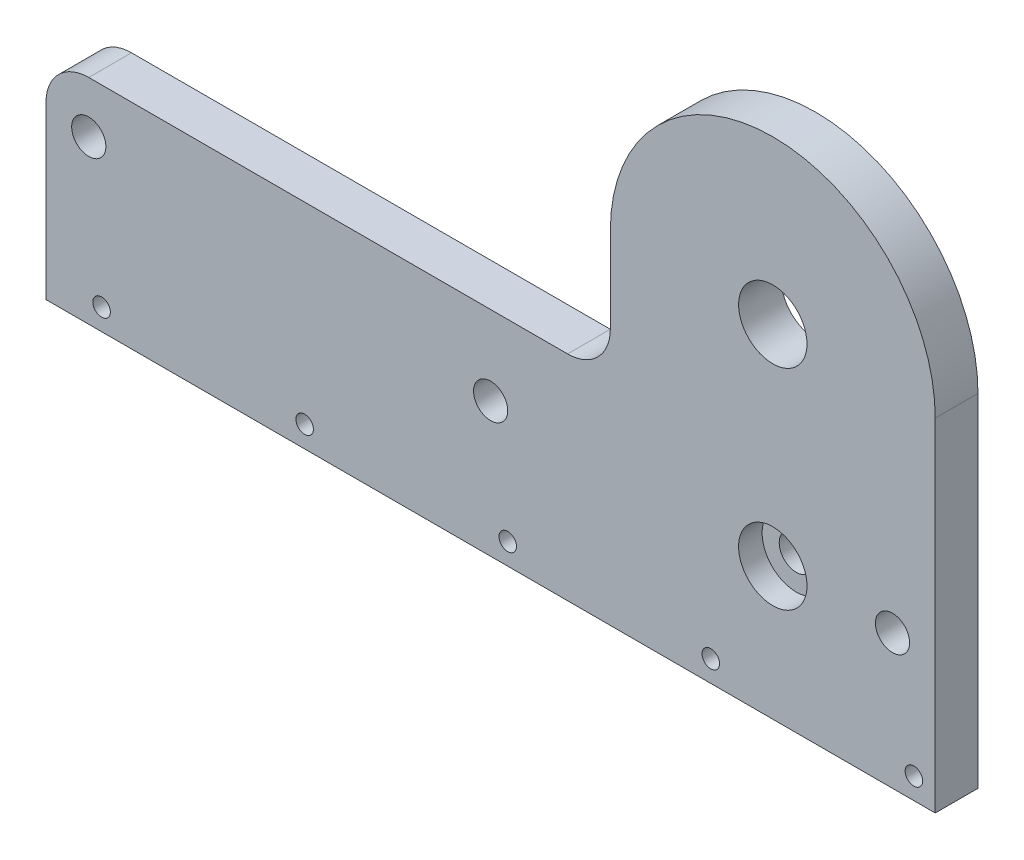
ISO-10303-21;
HEADER;
FILE_DESCRIPTION(('STEP AP214'),'2;1');
FILE_NAME('part.step','',(''),(''),'','','');
FILE_SCHEMA(('AUTOMOTIVE_DESIGN { 1 0 10303 214 1 1 1 1 }'));
ENDSEC;
DATA;
#1=APPLICATION_CONTEXT('core data for automotive mechanical design processes');
#2=APPLICATION_PROTOCOL_DEFINITION('international standard','automotive_design',2000,#1);
#3=PRODUCT_CONTEXT('',#1,'mechanical');
#4=PRODUCT('Part','Part','',(#3));
#5=PRODUCT_RELATED_PRODUCT_CATEGORY('part','',(#4));
#6=PRODUCT_DEFINITION_FORMATION('','',#4);
#7=PRODUCT_DEFINITION_CONTEXT('part definition',#1,'design');
#8=PRODUCT_DEFINITION('design','',#6,#7);
#9=PRODUCT_DEFINITION_SHAPE('','',#8);
#10=(LENGTH_UNIT() NAMED_UNIT(*) SI_UNIT(.MILLI.,.METRE.));
#11=(NAMED_UNIT(*) PLANE_ANGLE_UNIT() SI_UNIT($,.RADIAN.));
#12=(NAMED_UNIT(*) SI_UNIT($,.STERADIAN.) SOLID_ANGLE_UNIT());
#13=UNCERTAINTY_MEASURE_WITH_UNIT(LENGTH_MEASURE(1.E-05),#10,'distance_accuracy_value','');
#14=(GEOMETRIC_REPRESENTATION_CONTEXT(3) GLOBAL_UNCERTAINTY_ASSIGNED_CONTEXT((#13)) GLOBAL_UNIT_ASSIGNED_CONTEXT((#10,
#11,#12)) REPRESENTATION_CONTEXT('',''));
#15=CARTESIAN_POINT('',(0.,0.,0.));
#16=DIRECTION('',(0.,0.,1.));
#17=DIRECTION('',(1.,0.,0.));
#18=AXIS2_PLACEMENT_3D('',#15,#16,#17);
#19=CARTESIAN_POINT('',(170.,31.,-10.));
#20=DIRECTION('',(0.,0.,1.));
#21=DIRECTION('',(1.,0.,0.));
#22=AXIS2_PLACEMENT_3D('',#19,#20,#21);
#23=CYLINDRICAL_SURFACE('',#22,8.00000000000001);
#24=CARTESIAN_POINT('',(170.,31.,0.));
#25=DIRECTION('',(0.,0.,1.));
#26=DIRECTION('',(1.,0.,0.));
#27=AXIS2_PLACEMENT_3D('',#24,#25,#26);
#28=CIRCLE('',#27,8.00000000000001);
#29=CARTESIAN_POINT('',(178.,31.,0.));
#30=VERTEX_POINT('',#29);
#31=EDGE_CURVE('E156',#30,#30,#28,.T.);
#32=ORIENTED_EDGE('',*,*,#31,.T.);
#33=EDGE_LOOP('',(#32));
#34=FACE_BOUND('',#33,.T.);
#35=CARTESIAN_POINT('',(170.,31.,-5.5));
#36=DIRECTION('',(0.,0.,-1.));
#37=DIRECTION('',(-1.,0.,0.));
#38=AXIS2_PLACEMENT_3D('',#35,#36,#37);
#39=CIRCLE('',#38,8.00000000000001);
#40=CARTESIAN_POINT('',(162.,31.,-5.5));
#41=VERTEX_POINT('',#40);
#42=EDGE_CURVE('E11',#41,#41,#39,.F.);
#43=ORIENTED_EDGE('',*,*,#42,.F.);
#44=EDGE_LOOP('',(#43));
#45=FACE_BOUND('',#44,.T.);
#46=ADVANCED_FACE('F45',(#34,#45),#23,.F.);
#47=CARTESIAN_POINT('',(0.,0.,-10.));
#48=DIRECTION('',(-1.,0.,0.));
#49=DIRECTION('',(0.,0.,1.));
#50=AXIS2_PLACEMENT_3D('',#47,#48,#49);
#51=PLANE('',#50);
#52=DIRECTION('',(0.,-1.,0.));
#53=VECTOR('',#52,1.);
#54=CARTESIAN_POINT('',(0.,0.,0.));
#55=LINE('',#54,#53);
#56=CARTESIAN_POINT('',(0.,40.,0.));
#57=VERTEX_POINT('',#56);
#58=CARTESIAN_POINT('',(0.,0.,0.));
#59=VERTEX_POINT('',#58);
#60=EDGE_CURVE('E151',#57,#59,#55,.T.);
#61=ORIENTED_EDGE('',*,*,#60,.F.);
#62=DIRECTION('',(0.,0.,1.));
#63=VECTOR('',#62,1.);
#64=CARTESIAN_POINT('',(0.,40.,-10.));
#65=LINE('',#64,#63);
#66=CARTESIAN_POINT('',(0.,40.,-10.));
#67=VERTEX_POINT('',#66);
#68=EDGE_CURVE('E55',#67,#57,#65,.T.);
#69=ORIENTED_EDGE('',*,*,#68,.F.);
#70=DIRECTION('',(0.,-1.,0.));
#71=VECTOR('',#70,1.);
#72=CARTESIAN_POINT('',(0.,0.,-10.));
#73=LINE('',#72,#71);
#74=CARTESIAN_POINT('',(0.,0.,-10.));
#75=VERTEX_POINT('',#74);
#76=EDGE_CURVE('E181',#67,#75,#73,.T.);
#77=ORIENTED_EDGE('',*,*,#76,.T.);
#78=DIRECTION('',(0.,0.,1.));
#79=VECTOR('',#78,1.);
#80=CARTESIAN_POINT('',(0.,0.,-10.));
#81=LINE('',#80,#79);
#82=EDGE_CURVE('E103',#75,#59,#81,.T.);
#83=ORIENTED_EDGE('',*,*,#82,.T.);
#84=EDGE_LOOP('',(#61,#69,#77,#83));
#85=FACE_BOUND('',#84,.T.);
#86=ADVANCED_FACE('F47',(#85),#51,.T.);
#87=CARTESIAN_POINT('',(10.,40.,-10.));
#88=DIRECTION('',(0.,0.,1.));
#89=DIRECTION('',(1.,0.,0.));
#90=AXIS2_PLACEMENT_3D('',#87,#88,#89);
#91=CYLINDRICAL_SURFACE('',#90,10.);
#92=CARTESIAN_POINT('',(10.,40.,0.));
#93=DIRECTION('',(0.,0.,1.));
#94=DIRECTION('',(-1.,0.,0.));
#95=AXIS2_PLACEMENT_3D('',#92,#93,#94);
#96=CIRCLE('',#95,10.);
#97=CARTESIAN_POINT('',(10.,50.,0.));
#98=VERTEX_POINT('',#97);
#99=EDGE_CURVE('E177',#98,#57,#96,.T.);
#100=ORIENTED_EDGE('',*,*,#99,.F.);
#101=DIRECTION('',(0.,0.,1.));
#102=VECTOR('',#101,1.);
#103=CARTESIAN_POINT('',(10.,50.,-10.));
#104=LINE('',#103,#102);
#105=CARTESIAN_POINT('',(10.,50.,-10.));
#106=VERTEX_POINT('',#105);
#107=EDGE_CURVE('E91',#106,#98,#104,.T.);
#108=ORIENTED_EDGE('',*,*,#107,.F.);
#109=CARTESIAN_POINT('',(10.,40.,-10.));
#110=DIRECTION('',(0.,0.,1.));
#111=DIRECTION('',(-1.,0.,0.));
#112=AXIS2_PLACEMENT_3D('',#109,#110,#111);
#113=CIRCLE('',#112,10.);
#114=EDGE_CURVE('E137',#106,#67,#113,.T.);
#115=ORIENTED_EDGE('',*,*,#114,.T.);
#116=ORIENTED_EDGE('',*,*,#68,.T.);
#117=EDGE_LOOP('',(#100,#108,#115,#116));
#118=FACE_BOUND('',#117,.T.);
#119=ADVANCED_FACE('F201',(#118),#91,.T.);
#120=CARTESIAN_POINT('',(10.,50.,-10.));
#121=DIRECTION('',(0.,1.,0.));
#122=DIRECTION('',(0.,0.,1.));
#123=AXIS2_PLACEMENT_3D('',#120,#121,#122);
#124=PLANE('',#123);
#125=DIRECTION('',(-1.,0.,0.));
#126=VECTOR('',#125,1.);
#127=CARTESIAN_POINT('',(10.,50.,0.));
#128=LINE('',#127,#126);
#129=CARTESIAN_POINT('',(122.,50.,0.));
#130=VERTEX_POINT('',#129);
#131=EDGE_CURVE('E122',#130,#98,#128,.T.);
#132=ORIENTED_EDGE('',*,*,#131,.F.);
#133=DIRECTION('',(0.,0.,1.));
#134=VECTOR('',#133,1.);
#135=CARTESIAN_POINT('',(122.,50.,-10.));
#136=LINE('',#135,#134);
#137=CARTESIAN_POINT('',(122.,50.,-10.));
#138=VERTEX_POINT('',#137);
#139=EDGE_CURVE('E117',#138,#130,#136,.T.);
#140=ORIENTED_EDGE('',*,*,#139,.F.);
#141=DIRECTION('',(-1.,0.,0.));
#142=VECTOR('',#141,1.);
#143=CARTESIAN_POINT('',(10.,50.,-10.));
#144=LINE('',#143,#142);
#145=EDGE_CURVE('E120',#138,#106,#144,.T.);
#146=ORIENTED_EDGE('',*,*,#145,.T.);
#147=ORIENTED_EDGE('',*,*,#107,.T.);
#148=EDGE_LOOP('',(#132,#140,#146,#147));
#149=FACE_BOUND('',#148,.T.);
#150=ADVANCED_FACE('F119',(#149),#124,.T.);
#151=CARTESIAN_POINT('',(122.,60.,-10.));
#152=DIRECTION('',(0.,0.,1.));
#153=DIRECTION('',(1.,0.,0.));
#154=AXIS2_PLACEMENT_3D('',#151,#152,#153);
#155=CYLINDRICAL_SURFACE('',#154,10.);
#156=CARTESIAN_POINT('',(122.,60.,0.));
#157=DIRECTION('',(0.,0.,-1.));
#158=DIRECTION('',(1.,0.,0.));
#159=AXIS2_PLACEMENT_3D('',#156,#157,#158);
#160=CIRCLE('',#159,10.);
#161=CARTESIAN_POINT('',(132.,60.,0.));
#162=VERTEX_POINT('',#161);
#163=EDGE_CURVE('E172',#162,#130,#160,.T.);
#164=ORIENTED_EDGE('',*,*,#163,.F.);
#165=DIRECTION('',(0.,0.,1.));
#166=VECTOR('',#165,1.);
#167=CARTESIAN_POINT('',(132.,60.,-10.));
#168=LINE('',#167,#166);
#169=CARTESIAN_POINT('',(132.,60.,-10.));
#170=VERTEX_POINT('',#169);
#171=EDGE_CURVE('E128',#170,#162,#168,.T.);
#172=ORIENTED_EDGE('',*,*,#171,.F.);
#173=CARTESIAN_POINT('',(122.,60.,-10.));
#174=DIRECTION('',(0.,0.,-1.));
#175=DIRECTION('',(1.,0.,0.));
#176=AXIS2_PLACEMENT_3D('',#173,#174,#175);
#177=CIRCLE('',#176,10.);
#178=EDGE_CURVE('E135',#170,#138,#177,.T.);
#179=ORIENTED_EDGE('',*,*,#178,.T.);
#180=ORIENTED_EDGE('',*,*,#139,.T.);
#181=EDGE_LOOP('',(#164,#172,#179,#180));
#182=FACE_BOUND('',#181,.T.);
#183=ADVANCED_FACE('F140',(#182),#155,.F.);
#184=CARTESIAN_POINT('',(132.,60.,-10.));
#185=DIRECTION('',(-1.,0.,0.));
#186=DIRECTION('',(0.,0.,1.));
#187=AXIS2_PLACEMENT_3D('',#184,#185,#186);
#188=PLANE('',#187);
#189=DIRECTION('',(0.,-1.,0.));
#190=VECTOR('',#189,1.);
#191=CARTESIAN_POINT('',(132.,60.,0.));
#192=LINE('',#191,#190);
#193=CARTESIAN_POINT('',(132.,80.,0.));
#194=VERTEX_POINT('',#193);
#195=EDGE_CURVE('E168',#194,#162,#192,.T.);
#196=ORIENTED_EDGE('',*,*,#195,.F.);
#197=DIRECTION('',(0.,0.,1.));
#198=VECTOR('',#197,1.);
#199=CARTESIAN_POINT('',(132.,80.,-10.));
#200=LINE('',#199,#198);
#201=CARTESIAN_POINT('',(132.,80.,-10.));
#202=VERTEX_POINT('',#201);
#203=EDGE_CURVE('E188',#202,#194,#200,.T.);
#204=ORIENTED_EDGE('',*,*,#203,.F.);
#205=DIRECTION('',(0.,-1.,0.));
#206=VECTOR('',#205,1.);
#207=CARTESIAN_POINT('',(132.,60.,-10.));
#208=LINE('',#207,#206);
#209=EDGE_CURVE('E142',#202,#170,#208,.T.);
#210=ORIENTED_EDGE('',*,*,#209,.T.);
#211=ORIENTED_EDGE('',*,*,#171,.T.);
#212=EDGE_LOOP('',(#196,#204,#210,#211));
#213=FACE_BOUND('',#212,.T.);
#214=ADVANCED_FACE('F297',(#213),#188,.T.);
#215=CARTESIAN_POINT('',(170.,80.,-10.));
#216=DIRECTION('',(0.,0.,1.));
#217=DIRECTION('',(1.,0.,0.));
#218=AXIS2_PLACEMENT_3D('',#215,#216,#217);
#219=CYLINDRICAL_SURFACE('',#218,38.);
#220=CARTESIAN_POINT('',(170.,80.,0.));
#221=DIRECTION('',(0.,0.,1.));
#222=DIRECTION('',(1.,0.,0.));
#223=AXIS2_PLACEMENT_3D('',#220,#221,#222);
#224=CIRCLE('',#223,38.);
#225=CARTESIAN_POINT('',(208.,80.,0.));
#226=VERTEX_POINT('',#225);
#227=EDGE_CURVE('E164',#226,#194,#224,.T.);
#228=ORIENTED_EDGE('',*,*,#227,.F.);
#229=DIRECTION('',(0.,0.,1.));
#230=VECTOR('',#229,1.);
#231=CARTESIAN_POINT('',(208.,80.,-10.));
#232=LINE('',#231,#230);
#233=CARTESIAN_POINT('',(208.,80.,-10.));
#234=VERTEX_POINT('',#233);
#235=EDGE_CURVE('E191',#234,#226,#232,.T.);
#236=ORIENTED_EDGE('',*,*,#235,.F.);
#237=CARTESIAN_POINT('',(170.,80.,-10.));
#238=DIRECTION('',(0.,0.,1.));
#239=DIRECTION('',(1.,0.,0.));
#240=AXIS2_PLACEMENT_3D('',#237,#238,#239);
#241=CIRCLE('',#240,38.);
#242=EDGE_CURVE('E145',#234,#202,#241,.T.);
#243=ORIENTED_EDGE('',*,*,#242,.T.);
#244=ORIENTED_EDGE('',*,*,#203,.T.);
#245=EDGE_LOOP('',(#228,#236,#243,#244));
#246=FACE_BOUND('',#245,.T.);
#247=ADVANCED_FACE('F291',(#246),#219,.T.);
#248=CARTESIAN_POINT('',(208.,0.,-10.));
#249=DIRECTION('',(1.,0.,0.));
#250=DIRECTION('',(0.,0.,-1.));
#251=AXIS2_PLACEMENT_3D('',#248,#249,#250);
#252=PLANE('',#251);
#253=DIRECTION('',(0.,1.,0.));
#254=VECTOR('',#253,1.);
#255=CARTESIAN_POINT('',(208.,0.,0.));
#256=LINE('',#255,#254);
#257=CARTESIAN_POINT('',(208.,0.,0.));
#258=VERTEX_POINT('',#257);
#259=EDGE_CURVE('E160',#258,#226,#256,.T.);
#260=ORIENTED_EDGE('',*,*,#259,.F.);
#261=DIRECTION('',(0.,0.,1.));
#262=VECTOR('',#261,1.);
#263=CARTESIAN_POINT('',(208.,0.,-10.));
#264=LINE('',#263,#262);
#265=CARTESIAN_POINT('',(208.,0.,-10.));
#266=VERTEX_POINT('',#265);
#267=EDGE_CURVE('E194',#266,#258,#264,.T.);
#268=ORIENTED_EDGE('',*,*,#267,.F.);
#269=DIRECTION('',(0.,1.,0.));
#270=VECTOR('',#269,1.);
#271=CARTESIAN_POINT('',(208.,0.,-10.));
#272=LINE('',#271,#270);
#273=EDGE_CURVE('E283',#266,#234,#272,.T.);
#274=ORIENTED_EDGE('',*,*,#273,.T.);
#275=ORIENTED_EDGE('',*,*,#235,.T.);
#276=EDGE_LOOP('',(#260,#268,#274,#275));
#277=FACE_BOUND('',#276,.T.);
#278=ADVANCED_FACE('F295',(#277),#252,.T.);
#279=CARTESIAN_POINT('',(0.,0.,-10.));
#280=DIRECTION('',(0.,-1.,0.));
#281=DIRECTION('',(0.,0.,-1.));
#282=AXIS2_PLACEMENT_3D('',#279,#280,#281);
#283=PLANE('',#282);
#284=DIRECTION('',(1.,0.,0.));
#285=VECTOR('',#284,1.);
#286=CARTESIAN_POINT('',(0.,0.,0.));
#287=LINE('',#286,#285);
#288=EDGE_CURVE('E155',#59,#258,#287,.T.);
#289=ORIENTED_EDGE('',*,*,#288,.F.);
#290=ORIENTED_EDGE('',*,*,#82,.F.);
#291=DIRECTION('',(1.,0.,0.));
#292=VECTOR('',#291,1.);
#293=CARTESIAN_POINT('',(0.,0.,-10.));
#294=LINE('',#293,#292);
#295=EDGE_CURVE('E280',#75,#266,#294,.T.);
#296=ORIENTED_EDGE('',*,*,#295,.T.);
#297=ORIENTED_EDGE('',*,*,#267,.T.);
#298=EDGE_LOOP('',(#289,#290,#296,#297));
#299=FACE_BOUND('',#298,.T.);
#300=ADVANCED_FACE('F197',(#299),#283,.T.);
#301=CARTESIAN_POINT('',(10.,40.,-10.));
#302=DIRECTION('',(0.,0.,-1.));
#303=DIRECTION('',(-1.,0.,0.));
#304=AXIS2_PLACEMENT_3D('',#301,#302,#303);
#305=PLANE('',#304);
#306=CARTESIAN_POINT('',(198.,31.4904861806186,-10.));
#307=DIRECTION('',(0.,0.,1.));
#308=DIRECTION('',(1.,0.,0.));
#309=AXIS2_PLACEMENT_3D('',#306,#307,#308);
#310=CIRCLE('',#309,3.99999999999999);
#311=CARTESIAN_POINT('',(202.,31.4904861806186,-10.));
#312=VERTEX_POINT('',#311);
#313=EDGE_CURVE('E427',#312,#312,#310,.T.);
#314=ORIENTED_EDGE('',*,*,#313,.T.);
#315=EDGE_LOOP('',(#314));
#316=FACE_BOUND('',#315,.T.);
#317=CARTESIAN_POINT('',(104.,31.4904861806186,-10.));
#318=DIRECTION('',(0.,0.,1.));
#319=DIRECTION('',(1.,0.,0.));
#320=AXIS2_PLACEMENT_3D('',#317,#318,#319);
#321=CIRCLE('',#320,3.99999999999999);
#322=CARTESIAN_POINT('',(108.,31.4904861806186,-10.));
#323=VERTEX_POINT('',#322);
#324=EDGE_CURVE('E434',#323,#323,#321,.T.);
#325=ORIENTED_EDGE('',*,*,#324,.T.);
#326=EDGE_LOOP('',(#325));
#327=FACE_BOUND('',#326,.T.);
#328=CARTESIAN_POINT('',(10.,38.,-10.));
#329=DIRECTION('',(0.,0.,1.));
#330=DIRECTION('',(1.,0.,0.));
#331=AXIS2_PLACEMENT_3D('',#328,#329,#330);
#332=CIRCLE('',#331,4.);
#333=CARTESIAN_POINT('',(14.,38.,-10.));
#334=VERTEX_POINT('',#333);
#335=EDGE_CURVE('E442',#334,#334,#332,.T.);
#336=ORIENTED_EDGE('',*,*,#335,.T.);
#337=EDGE_LOOP('',(#336));
#338=FACE_BOUND('',#337,.T.);
#339=CARTESIAN_POINT('',(203.,5.,-10.));
#340=DIRECTION('',(0.,0.,-1.));
#341=DIRECTION('',(-1.,0.,0.));
#342=AXIS2_PLACEMENT_3D('',#339,#340,#341);
#343=CIRCLE('',#342,2.04999999999999);
#344=CARTESIAN_POINT('',(200.95,5.,-10.));
#345=VERTEX_POINT('',#344);
#346=EDGE_CURVE('E455',#345,#345,#343,.T.);
#347=ORIENTED_EDGE('',*,*,#346,.F.);
#348=EDGE_LOOP('',(#347));
#349=FACE_BOUND('',#348,.T.);
#350=CARTESIAN_POINT('',(155.5,5.,-10.));
#351=DIRECTION('',(0.,0.,-1.));
#352=DIRECTION('',(-1.,0.,0.));
#353=AXIS2_PLACEMENT_3D('',#350,#351,#352);
#354=CIRCLE('',#353,2.04999999999999);
#355=CARTESIAN_POINT('',(153.45,5.,-10.));
#356=VERTEX_POINT('',#355);
#357=EDGE_CURVE('E459',#356,#356,#354,.T.);
#358=ORIENTED_EDGE('',*,*,#357,.F.);
#359=EDGE_LOOP('',(#358));
#360=FACE_BOUND('',#359,.T.);
#361=CARTESIAN_POINT('',(108.,5.,-10.));
#362=DIRECTION('',(0.,0.,-1.));
#363=DIRECTION('',(-1.,0.,0.));
#364=AXIS2_PLACEMENT_3D('',#361,#362,#363);
#365=CIRCLE('',#364,2.04999999999999);
#366=CARTESIAN_POINT('',(105.95,5.,-10.));
#367=VERTEX_POINT('',#366);
#368=EDGE_CURVE('E465',#367,#367,#365,.T.);
#369=ORIENTED_EDGE('',*,*,#368,.F.);
#370=EDGE_LOOP('',(#369));
#371=FACE_BOUND('',#370,.T.);
#372=CARTESIAN_POINT('',(60.5,5.,-10.));
#373=DIRECTION('',(0.,0.,-1.));
#374=DIRECTION('',(-1.,0.,0.));
#375=AXIS2_PLACEMENT_3D('',#372,#373,#374);
#376=CIRCLE('',#375,2.04999999999999);
#377=CARTESIAN_POINT('',(58.45,5.,-10.));
#378=VERTEX_POINT('',#377);
#379=EDGE_CURVE('E471',#378,#378,#376,.T.);
#380=ORIENTED_EDGE('',*,*,#379,.F.);
#381=EDGE_LOOP('',(#380));
#382=FACE_BOUND('',#381,.T.);
#383=CARTESIAN_POINT('',(13.,5.,-10.));
#384=DIRECTION('',(0.,0.,-1.));
#385=DIRECTION('',(-1.,0.,0.));
#386=AXIS2_PLACEMENT_3D('',#383,#384,#385);
#387=CIRCLE('',#386,2.05);
#388=CARTESIAN_POINT('',(10.95,5.,-10.));
#389=VERTEX_POINT('',#388);
#390=EDGE_CURVE('E477',#389,#389,#387,.T.);
#391=ORIENTED_EDGE('',*,*,#390,.F.);
#392=EDGE_LOOP('',(#391));
#393=FACE_BOUND('',#392,.T.);
#394=CARTESIAN_POINT('',(170.,80.,-10.));
#395=DIRECTION('',(0.,0.,1.));
#396=DIRECTION('',(1.,0.,0.));
#397=AXIS2_PLACEMENT_3D('',#394,#395,#396);
#398=CIRCLE('',#397,8.00000000000001);
#399=CARTESIAN_POINT('',(178.,80.,-10.));
#400=VERTEX_POINT('',#399);
#401=EDGE_CURVE('E271',#400,#400,#398,.T.);
#402=ORIENTED_EDGE('',*,*,#401,.T.);
#403=EDGE_LOOP('',(#402));
#404=FACE_BOUND('',#403,.T.);
#405=ORIENTED_EDGE('',*,*,#76,.F.);
#406=ORIENTED_EDGE('',*,*,#114,.F.);
#407=ORIENTED_EDGE('',*,*,#145,.F.);
#408=ORIENTED_EDGE('',*,*,#178,.F.);
#409=ORIENTED_EDGE('',*,*,#209,.F.);
#410=ORIENTED_EDGE('',*,*,#242,.F.);
#411=ORIENTED_EDGE('',*,*,#273,.F.);
#412=ORIENTED_EDGE('',*,*,#295,.F.);
#413=EDGE_LOOP('',(#405,#406,#407,#408,#409,#410,#411,#412));
#414=FACE_BOUND('',#413,.T.);
#415=CARTESIAN_POINT('',(170.,31.,-10.));
#416=DIRECTION('',(0.,0.,-1.));
#417=DIRECTION('',(-1.,0.,0.));
#418=AXIS2_PLACEMENT_3D('',#415,#416,#417);
#419=CIRCLE('',#418,3.99999999999999);
#420=CARTESIAN_POINT('',(166.,31.,-10.));
#421=VERTEX_POINT('',#420);
#422=EDGE_CURVE('E432',#421,#421,#419,.T.);
#423=ORIENTED_EDGE('',*,*,#422,.F.);
#424=EDGE_LOOP('',(#423));
#425=FACE_BOUND('',#424,.T.);
#426=ADVANCED_FACE('F132',(#316,#327,#338,#349,#360,#371,#382,#393,#404,#414,#425),#305,.T.);
#427=CARTESIAN_POINT('',(10.,40.,0.));
#428=DIRECTION('',(0.,0.,-1.));
#429=DIRECTION('',(-1.,0.,0.));
#430=AXIS2_PLACEMENT_3D('',#427,#428,#429);
#431=PLANE('',#430);
#432=CARTESIAN_POINT('',(198.,31.4904861806186,0.));
#433=DIRECTION('',(0.,0.,1.));
#434=DIRECTION('',(1.,0.,0.));
#435=AXIS2_PLACEMENT_3D('',#432,#433,#434);
#436=CIRCLE('',#435,3.99999999999999);
#437=CARTESIAN_POINT('',(202.,31.4904861806186,0.));
#438=VERTEX_POINT('',#437);
#439=EDGE_CURVE('E236',#438,#438,#436,.T.);
#440=ORIENTED_EDGE('',*,*,#439,.F.);
#441=EDGE_LOOP('',(#440));
#442=FACE_BOUND('',#441,.T.);
#443=CARTESIAN_POINT('',(104.,31.4904861806186,0.));
#444=DIRECTION('',(0.,0.,1.));
#445=DIRECTION('',(1.,0.,0.));
#446=AXIS2_PLACEMENT_3D('',#443,#444,#445);
#447=CIRCLE('',#446,3.99999999999999);
#448=CARTESIAN_POINT('',(108.,31.4904861806186,0.));
#449=VERTEX_POINT('',#448);
#450=EDGE_CURVE('E240',#449,#449,#447,.T.);
#451=ORIENTED_EDGE('',*,*,#450,.F.);
#452=EDGE_LOOP('',(#451));
#453=FACE_BOUND('',#452,.T.);
#454=CARTESIAN_POINT('',(10.,38.,0.));
#455=DIRECTION('',(0.,0.,1.));
#456=DIRECTION('',(1.,0.,0.));
#457=AXIS2_PLACEMENT_3D('',#454,#455,#456);
#458=CIRCLE('',#457,4.);
#459=CARTESIAN_POINT('',(14.,38.,0.));
#460=VERTEX_POINT('',#459);
#461=EDGE_CURVE('E244',#460,#460,#458,.T.);
#462=ORIENTED_EDGE('',*,*,#461,.F.);
#463=EDGE_LOOP('',(#462));
#464=FACE_BOUND('',#463,.T.);
#465=CARTESIAN_POINT('',(203.,5.,0.));
#466=DIRECTION('',(0.,0.,-1.));
#467=DIRECTION('',(-1.,0.,0.));
#468=AXIS2_PLACEMENT_3D('',#465,#466,#467);
#469=CIRCLE('',#468,2.04999999999999);
#470=CARTESIAN_POINT('',(200.95,5.,0.));
#471=VERTEX_POINT('',#470);
#472=EDGE_CURVE('E248',#471,#471,#469,.T.);
#473=ORIENTED_EDGE('',*,*,#472,.T.);
#474=EDGE_LOOP('',(#473));
#475=FACE_BOUND('',#474,.T.);
#476=CARTESIAN_POINT('',(155.5,5.,0.));
#477=DIRECTION('',(0.,0.,-1.));
#478=DIRECTION('',(-1.,0.,0.));
#479=AXIS2_PLACEMENT_3D('',#476,#477,#478);
#480=CIRCLE('',#479,2.04999999999999);
#481=CARTESIAN_POINT('',(153.45,5.,0.));
#482=VERTEX_POINT('',#481);
#483=EDGE_CURVE('E252',#482,#482,#480,.T.);
#484=ORIENTED_EDGE('',*,*,#483,.T.);
#485=EDGE_LOOP('',(#484));
#486=FACE_BOUND('',#485,.T.);
#487=CARTESIAN_POINT('',(108.,5.,0.));
#488=DIRECTION('',(0.,0.,-1.));
#489=DIRECTION('',(-1.,0.,0.));
#490=AXIS2_PLACEMENT_3D('',#487,#488,#489);
#491=CIRCLE('',#490,2.04999999999999);
#492=CARTESIAN_POINT('',(105.95,5.,0.));
#493=VERTEX_POINT('',#492);
#494=EDGE_CURVE('E256',#493,#493,#491,.T.);
#495=ORIENTED_EDGE('',*,*,#494,.T.);
#496=EDGE_LOOP('',(#495));
#497=FACE_BOUND('',#496,.T.);
#498=CARTESIAN_POINT('',(60.5,5.,0.));
#499=DIRECTION('',(0.,0.,-1.));
#500=DIRECTION('',(-1.,0.,0.));
#501=AXIS2_PLACEMENT_3D('',#498,#499,#500);
#502=CIRCLE('',#501,2.04999999999999);
#503=CARTESIAN_POINT('',(58.45,5.,0.));
#504=VERTEX_POINT('',#503);
#505=EDGE_CURVE('E260',#504,#504,#502,.T.);
#506=ORIENTED_EDGE('',*,*,#505,.T.);
#507=EDGE_LOOP('',(#506));
#508=FACE_BOUND('',#507,.T.);
#509=CARTESIAN_POINT('',(13.,5.,0.));
#510=DIRECTION('',(0.,0.,-1.));
#511=DIRECTION('',(-1.,0.,0.));
#512=AXIS2_PLACEMENT_3D('',#509,#510,#511);
#513=CIRCLE('',#512,2.05);
#514=CARTESIAN_POINT('',(10.95,5.,0.));
#515=VERTEX_POINT('',#514);
#516=EDGE_CURVE('E264',#515,#515,#513,.T.);
#517=ORIENTED_EDGE('',*,*,#516,.T.);
#518=EDGE_LOOP('',(#517));
#519=FACE_BOUND('',#518,.T.);
#520=CARTESIAN_POINT('',(170.,80.,0.));
#521=DIRECTION('',(0.,0.,1.));
#522=DIRECTION('',(1.,0.,0.));
#523=AXIS2_PLACEMENT_3D('',#520,#521,#522);
#524=CIRCLE('',#523,8.00000000000001);
#525=CARTESIAN_POINT('',(178.,80.,0.));
#526=VERTEX_POINT('',#525);
#527=EDGE_CURVE('E268',#526,#526,#524,.T.);
#528=ORIENTED_EDGE('',*,*,#527,.F.);
#529=EDGE_LOOP('',(#528));
#530=FACE_BOUND('',#529,.T.);
#531=ORIENTED_EDGE('',*,*,#31,.F.);
#532=EDGE_LOOP('',(#531));
#533=FACE_BOUND('',#532,.T.);
#534=ORIENTED_EDGE('',*,*,#60,.T.);
#535=ORIENTED_EDGE('',*,*,#288,.T.);
#536=ORIENTED_EDGE('',*,*,#259,.T.);
#537=ORIENTED_EDGE('',*,*,#227,.T.);
#538=ORIENTED_EDGE('',*,*,#195,.T.);
#539=ORIENTED_EDGE('',*,*,#163,.T.);
#540=ORIENTED_EDGE('',*,*,#131,.T.);
#541=ORIENTED_EDGE('',*,*,#99,.T.);
#542=EDGE_LOOP('',(#534,#535,#536,#537,#538,#539,#540,#541));
#543=FACE_BOUND('',#542,.T.);
#544=ADVANCED_FACE('F200',(#442,#453,#464,#475,#486,#497,#508,#519,#530,#533,#543),#431,.F.);
#545=CARTESIAN_POINT('',(170.,80.,-10.));
#546=DIRECTION('',(0.,0.,1.));
#547=DIRECTION('',(1.,0.,0.));
#548=AXIS2_PLACEMENT_3D('',#545,#546,#547);
#549=CYLINDRICAL_SURFACE('',#548,8.00000000000001);
#550=ORIENTED_EDGE('',*,*,#401,.F.);
#551=EDGE_LOOP('',(#550));
#552=FACE_BOUND('',#551,.T.);
#553=ORIENTED_EDGE('',*,*,#527,.T.);
#554=EDGE_LOOP('',(#553));
#555=FACE_BOUND('',#554,.T.);
#556=ADVANCED_FACE('F221',(#552,#555),#549,.F.);
#557=CARTESIAN_POINT('',(13.,5.,0.));
#558=DIRECTION('',(0.,0.,-1.));
#559=DIRECTION('',(-1.,0.,0.));
#560=AXIS2_PLACEMENT_3D('',#557,#558,#559);
#561=CYLINDRICAL_SURFACE('',#560,2.05);
#562=ORIENTED_EDGE('',*,*,#516,.F.);
#563=EDGE_LOOP('',(#562));
#564=FACE_BOUND('',#563,.T.);
#565=ORIENTED_EDGE('',*,*,#390,.T.);
#566=EDGE_LOOP('',(#565));
#567=FACE_BOUND('',#566,.T.);
#568=ADVANCED_FACE('F231',(#564,#567),#561,.F.);
#569=CARTESIAN_POINT('',(60.5,5.,0.));
#570=DIRECTION('',(0.,0.,-1.));
#571=DIRECTION('',(-1.,0.,0.));
#572=AXIS2_PLACEMENT_3D('',#569,#570,#571);
#573=CYLINDRICAL_SURFACE('',#572,2.04999999999999);
#574=ORIENTED_EDGE('',*,*,#505,.F.);
#575=EDGE_LOOP('',(#574));
#576=FACE_BOUND('',#575,.T.);
#577=ORIENTED_EDGE('',*,*,#379,.T.);
#578=EDGE_LOOP('',(#577));
#579=FACE_BOUND('',#578,.T.);
#580=ADVANCED_FACE('F326',(#576,#579),#573,.F.);
#581=CARTESIAN_POINT('',(108.,5.,0.));
#582=DIRECTION('',(0.,0.,-1.));
#583=DIRECTION('',(-1.,0.,0.));
#584=AXIS2_PLACEMENT_3D('',#581,#582,#583);
#585=CYLINDRICAL_SURFACE('',#584,2.04999999999999);
#586=ORIENTED_EDGE('',*,*,#494,.F.);
#587=EDGE_LOOP('',(#586));
#588=FACE_BOUND('',#587,.T.);
#589=ORIENTED_EDGE('',*,*,#368,.T.);
#590=EDGE_LOOP('',(#589));
#591=FACE_BOUND('',#590,.T.);
#592=ADVANCED_FACE('F334',(#588,#591),#585,.F.);
#593=CARTESIAN_POINT('',(155.5,5.,0.));
#594=DIRECTION('',(0.,0.,-1.));
#595=DIRECTION('',(-1.,0.,0.));
#596=AXIS2_PLACEMENT_3D('',#593,#594,#595);
#597=CYLINDRICAL_SURFACE('',#596,2.04999999999999);
#598=ORIENTED_EDGE('',*,*,#483,.F.);
#599=EDGE_LOOP('',(#598));
#600=FACE_BOUND('',#599,.T.);
#601=ORIENTED_EDGE('',*,*,#357,.T.);
#602=EDGE_LOOP('',(#601));
#603=FACE_BOUND('',#602,.T.);
#604=ADVANCED_FACE('F343',(#600,#603),#597,.F.);
#605=CARTESIAN_POINT('',(203.,5.,0.));
#606=DIRECTION('',(0.,0.,-1.));
#607=DIRECTION('',(-1.,0.,0.));
#608=AXIS2_PLACEMENT_3D('',#605,#606,#607);
#609=CYLINDRICAL_SURFACE('',#608,2.04999999999999);
#610=ORIENTED_EDGE('',*,*,#472,.F.);
#611=EDGE_LOOP('',(#610));
#612=FACE_BOUND('',#611,.T.);
#613=ORIENTED_EDGE('',*,*,#346,.T.);
#614=EDGE_LOOP('',(#613));
#615=FACE_BOUND('',#614,.T.);
#616=ADVANCED_FACE('F351',(#612,#615),#609,.F.);
#617=CARTESIAN_POINT('',(170.,31.,-5.5));
#618=DIRECTION('',(0.,0.,-1.));
#619=DIRECTION('',(-1.,0.,0.));
#620=AXIS2_PLACEMENT_3D('',#617,#618,#619);
#621=PLANE('',#620);
#622=CARTESIAN_POINT('',(170.,31.,-5.5));
#623=DIRECTION('',(0.,0.,-1.));
#624=DIRECTION('',(-1.,0.,0.));
#625=AXIS2_PLACEMENT_3D('',#622,#623,#624);
#626=CIRCLE('',#625,3.99999999999999);
#627=CARTESIAN_POINT('',(166.,31.,-5.5));
#628=VERTEX_POINT('',#627);
#629=EDGE_CURVE('E446',#628,#628,#626,.T.);
#630=ORIENTED_EDGE('',*,*,#629,.T.);
#631=EDGE_LOOP('',(#630));
#632=FACE_BOUND('',#631,.T.);
#633=ORIENTED_EDGE('',*,*,#42,.T.);
#634=EDGE_LOOP('',(#633));
#635=FACE_BOUND('',#634,.T.);
#636=ADVANCED_FACE('F359',(#632,#635),#621,.F.);
#637=CARTESIAN_POINT('',(170.,31.,-5.5));
#638=DIRECTION('',(0.,0.,-1.));
#639=DIRECTION('',(-1.,0.,0.));
#640=AXIS2_PLACEMENT_3D('',#637,#638,#639);
#641=CYLINDRICAL_SURFACE('',#640,3.99999999999999);
#642=ORIENTED_EDGE('',*,*,#629,.F.);
#643=EDGE_LOOP('',(#642));
#644=FACE_BOUND('',#643,.T.);
#645=ORIENTED_EDGE('',*,*,#422,.T.);
#646=EDGE_LOOP('',(#645));
#647=FACE_BOUND('',#646,.T.);
#648=ADVANCED_FACE('F383',(#644,#647),#641,.F.);
#649=CARTESIAN_POINT('',(10.,38.,-10.));
#650=DIRECTION('',(0.,0.,1.));
#651=DIRECTION('',(1.,0.,0.));
#652=AXIS2_PLACEMENT_3D('',#649,#650,#651);
#653=CYLINDRICAL_SURFACE('',#652,4.);
#654=ORIENTED_EDGE('',*,*,#335,.F.);
#655=EDGE_LOOP('',(#654));
#656=FACE_BOUND('',#655,.T.);
#657=ORIENTED_EDGE('',*,*,#461,.T.);
#658=EDGE_LOOP('',(#657));
#659=FACE_BOUND('',#658,.T.);
#660=ADVANCED_FACE('F392',(#656,#659),#653,.F.);
#661=CARTESIAN_POINT('',(104.,31.4904861806186,-10.));
#662=DIRECTION('',(0.,0.,1.));
#663=DIRECTION('',(1.,0.,0.));
#664=AXIS2_PLACEMENT_3D('',#661,#662,#663);
#665=CYLINDRICAL_SURFACE('',#664,3.99999999999999);
#666=ORIENTED_EDGE('',*,*,#324,.F.);
#667=EDGE_LOOP('',(#666));
#668=FACE_BOUND('',#667,.T.);
#669=ORIENTED_EDGE('',*,*,#450,.T.);
#670=EDGE_LOOP('',(#669));
#671=FACE_BOUND('',#670,.T.);
#672=ADVANCED_FACE('F401',(#668,#671),#665,.F.);
#673=CARTESIAN_POINT('',(198.,31.4904861806186,-10.));
#674=DIRECTION('',(0.,0.,1.));
#675=DIRECTION('',(1.,0.,0.));
#676=AXIS2_PLACEMENT_3D('',#673,#674,#675);
#677=CYLINDRICAL_SURFACE('',#676,3.99999999999999);
#678=ORIENTED_EDGE('',*,*,#313,.F.);
#679=EDGE_LOOP('',(#678));
#680=FACE_BOUND('',#679,.T.);
#681=ORIENTED_EDGE('',*,*,#439,.T.);
#682=EDGE_LOOP('',(#681));
#683=FACE_BOUND('',#682,.T.);
#684=ADVANCED_FACE('F411',(#680,#683),#677,.F.);
#685=CLOSED_SHELL('',(#46,#86,#119,#150,#183,#214,#247,#278,#300,#426,#544,#556,#568,#580,#592,
#604,#616,#636,#648,#660,#672,#684));
#686=MANIFOLD_SOLID_BREP('B2',#685);
#687=ADVANCED_BREP_SHAPE_REPRESENTATION('',(#18,#686),#14);
#688=SHAPE_DEFINITION_REPRESENTATION(#9,#687);
ENDSEC;
END-ISO-10303-21;
